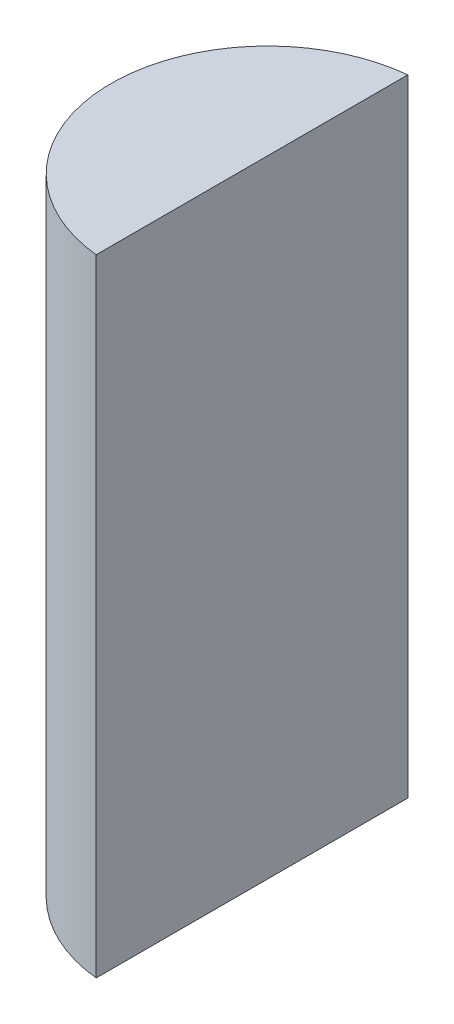
ISO-10303-21;
HEADER;
FILE_DESCRIPTION(('STEP AP214'),'2;1');
FILE_NAME('part.step','',(''),(''),'','','');
FILE_SCHEMA(('AUTOMOTIVE_DESIGN { 1 0 10303 214 1 1 1 1 }'));
ENDSEC;
DATA;
#1=APPLICATION_CONTEXT('core data for automotive mechanical design processes');
#2=APPLICATION_PROTOCOL_DEFINITION('international standard','automotive_design',2000,#1);
#3=PRODUCT_CONTEXT('',#1,'mechanical');
#4=PRODUCT('Part','Part','',(#3));
#5=PRODUCT_RELATED_PRODUCT_CATEGORY('part','',(#4));
#6=PRODUCT_DEFINITION_FORMATION('','',#4);
#7=PRODUCT_DEFINITION_CONTEXT('part definition',#1,'design');
#8=PRODUCT_DEFINITION('design','',#6,#7);
#9=PRODUCT_DEFINITION_SHAPE('','',#8);
#10=(LENGTH_UNIT() NAMED_UNIT(*) SI_UNIT(.MILLI.,.METRE.));
#11=(NAMED_UNIT(*) PLANE_ANGLE_UNIT() SI_UNIT($,.RADIAN.));
#12=(NAMED_UNIT(*) SI_UNIT($,.STERADIAN.) SOLID_ANGLE_UNIT());
#13=UNCERTAINTY_MEASURE_WITH_UNIT(LENGTH_MEASURE(1.E-05),#10,'distance_accuracy_value','');
#14=(GEOMETRIC_REPRESENTATION_CONTEXT(3) GLOBAL_UNCERTAINTY_ASSIGNED_CONTEXT((#13)) GLOBAL_UNIT_ASSIGNED_CONTEXT((#10,
#11,#12)) REPRESENTATION_CONTEXT('',''));
#15=CARTESIAN_POINT('',(0.,0.,0.));
#16=DIRECTION('',(0.,0.,1.));
#17=DIRECTION('',(1.,0.,0.));
#18=AXIS2_PLACEMENT_3D('',#15,#16,#17);
#19=CARTESIAN_POINT('',(0.,200.,0.));
#20=DIRECTION('',(0.,-1.,0.));
#21=DIRECTION('',(0.,0.,-1.));
#22=AXIS2_PLACEMENT_3D('',#19,#20,#21);
#23=CYLINDRICAL_SURFACE('',#22,50.);
#24=CARTESIAN_POINT('',(0.,0.,0.));
#25=DIRECTION('',(0.,1.,0.));
#26=DIRECTION('',(0.,0.,1.));
#27=AXIS2_PLACEMENT_3D('',#24,#25,#26);
#28=CIRCLE('',#27,50.);
#29=CARTESIAN_POINT('',(-5.,0.,-49.749371855331));
#30=VERTEX_POINT('',#29);
#31=CARTESIAN_POINT('',(-5.,0.,49.749371855331));
#32=VERTEX_POINT('',#31);
#33=EDGE_CURVE('E64',#30,#32,#28,.T.);
#34=ORIENTED_EDGE('',*,*,#33,.T.);
#35=DIRECTION('',(0.,-1.,0.));
#36=VECTOR('',#35,1.);
#37=CARTESIAN_POINT('',(-5.,200.,49.749371855331));
#38=LINE('',#37,#36);
#39=CARTESIAN_POINT('',(-5.,200.,49.749371855331));
#40=VERTEX_POINT('',#39);
#41=EDGE_CURVE('E11',#40,#32,#38,.T.);
#42=ORIENTED_EDGE('',*,*,#41,.F.);
#43=CARTESIAN_POINT('',(0.,200.,0.));
#44=DIRECTION('',(0.,1.,0.));
#45=DIRECTION('',(0.,0.,1.));
#46=AXIS2_PLACEMENT_3D('',#43,#44,#45);
#47=CIRCLE('',#46,50.);
#48=CARTESIAN_POINT('',(-5.,200.,-49.749371855331));
#49=VERTEX_POINT('',#48);
#50=EDGE_CURVE('E63',#49,#40,#47,.T.);
#51=ORIENTED_EDGE('',*,*,#50,.F.);
#52=DIRECTION('',(0.,-1.,0.));
#53=VECTOR('',#52,1.);
#54=CARTESIAN_POINT('',(-5.,200.,-49.749371855331));
#55=LINE('',#54,#53);
#56=EDGE_CURVE('E41',#49,#30,#55,.T.);
#57=ORIENTED_EDGE('',*,*,#56,.T.);
#58=EDGE_LOOP('',(#34,#42,#51,#57));
#59=FACE_BOUND('',#58,.T.);
#60=ADVANCED_FACE('F33',(#59),#23,.T.);
#61=CARTESIAN_POINT('',(-5.,200.,-49.749371855331));
#62=DIRECTION('',(-1.,0.,0.));
#63=DIRECTION('',(0.,0.,1.));
#64=AXIS2_PLACEMENT_3D('',#61,#62,#63);
#65=PLANE('',#64);
#66=DIRECTION('',(0.,0.,-1.));
#67=VECTOR('',#66,1.);
#68=CARTESIAN_POINT('',(-5.,0.,-49.749371855331));
#69=LINE('',#68,#67);
#70=EDGE_CURVE('E56',#32,#30,#69,.T.);
#71=ORIENTED_EDGE('',*,*,#70,.T.);
#72=ORIENTED_EDGE('',*,*,#56,.F.);
#73=DIRECTION('',(0.,0.,-1.));
#74=VECTOR('',#73,1.);
#75=CARTESIAN_POINT('',(-5.,200.,-49.749371855331));
#76=LINE('',#75,#74);
#77=EDGE_CURVE('E48',#40,#49,#76,.T.);
#78=ORIENTED_EDGE('',*,*,#77,.F.);
#79=ORIENTED_EDGE('',*,*,#41,.T.);
#80=EDGE_LOOP('',(#71,#72,#78,#79));
#81=FACE_BOUND('',#80,.T.);
#82=ADVANCED_FACE('F59',(#81),#65,.F.);
#83=CARTESIAN_POINT('',(0.,200.,0.));
#84=DIRECTION('',(0.,1.,0.));
#85=DIRECTION('',(0.,0.,1.));
#86=AXIS2_PLACEMENT_3D('',#83,#84,#85);
#87=PLANE('',#86);
#88=ORIENTED_EDGE('',*,*,#50,.T.);
#89=ORIENTED_EDGE('',*,*,#77,.T.);
#90=EDGE_LOOP('',(#88,#89));
#91=FACE_BOUND('',#90,.T.);
#92=ADVANCED_FACE('F71',(#91),#87,.T.);
#93=CARTESIAN_POINT('',(0.,0.,0.));
#94=DIRECTION('',(0.,1.,0.));
#95=DIRECTION('',(0.,0.,1.));
#96=AXIS2_PLACEMENT_3D('',#93,#94,#95);
#97=PLANE('',#96);
#98=ORIENTED_EDGE('',*,*,#33,.F.);
#99=ORIENTED_EDGE('',*,*,#70,.F.);
#100=EDGE_LOOP('',(#98,#99));
#101=FACE_BOUND('',#100,.T.);
#102=ADVANCED_FACE('F67',(#101),#97,.F.);
#103=CLOSED_SHELL('',(#60,#82,#92,#102));
#104=MANIFOLD_SOLID_BREP('B2',#103);
#105=ADVANCED_BREP_SHAPE_REPRESENTATION('',(#18,#104),#14);
#106=SHAPE_DEFINITION_REPRESENTATION(#9,#105);
ENDSEC;
END-ISO-10303-21;
